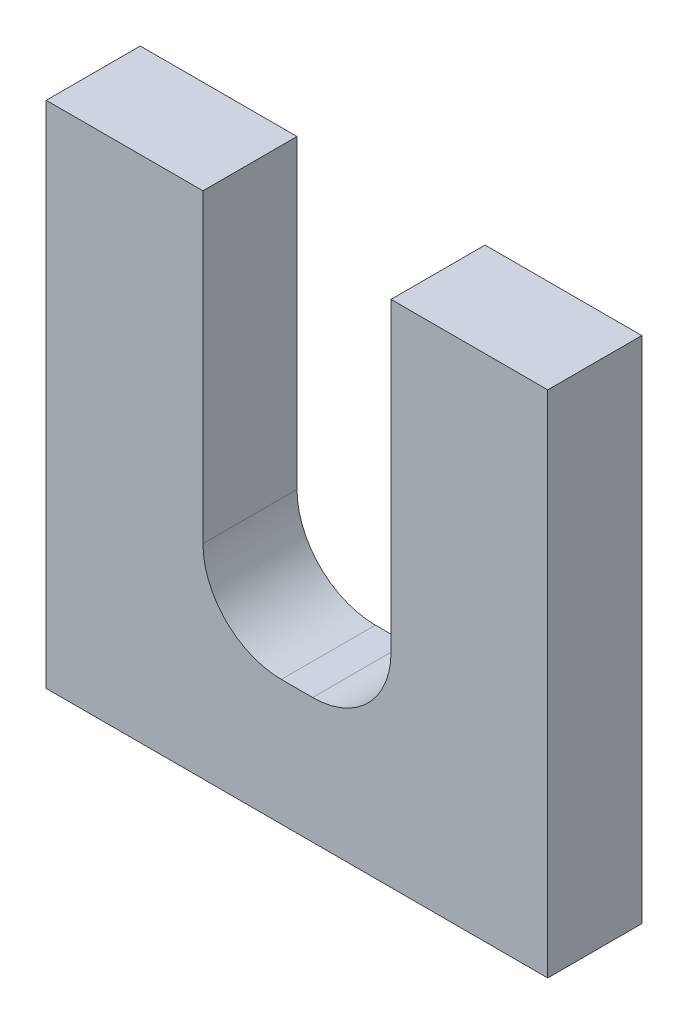
ISO-10303-21;
HEADER;
FILE_DESCRIPTION(('STEP AP214'),'2;1');
FILE_NAME('part.step','',(''),(''),'','','');
FILE_SCHEMA(('AUTOMOTIVE_DESIGN { 1 0 10303 214 1 1 1 1 }'));
ENDSEC;
DATA;
#1=APPLICATION_CONTEXT('core data for automotive mechanical design processes');
#2=APPLICATION_PROTOCOL_DEFINITION('international standard','automotive_design',2000,#1);
#3=PRODUCT_CONTEXT('',#1,'mechanical');
#4=PRODUCT('Part','Part','',(#3));
#5=PRODUCT_RELATED_PRODUCT_CATEGORY('part','',(#4));
#6=PRODUCT_DEFINITION_FORMATION('','',#4);
#7=PRODUCT_DEFINITION_CONTEXT('part definition',#1,'design');
#8=PRODUCT_DEFINITION('design','',#6,#7);
#9=PRODUCT_DEFINITION_SHAPE('','',#8);
#10=(LENGTH_UNIT() NAMED_UNIT(*) SI_UNIT(.MILLI.,.METRE.));
#11=(NAMED_UNIT(*) PLANE_ANGLE_UNIT() SI_UNIT($,.RADIAN.));
#12=(NAMED_UNIT(*) SI_UNIT($,.STERADIAN.) SOLID_ANGLE_UNIT());
#13=UNCERTAINTY_MEASURE_WITH_UNIT(LENGTH_MEASURE(1.E-05),#10,'distance_accuracy_value','');
#14=(GEOMETRIC_REPRESENTATION_CONTEXT(3) GLOBAL_UNCERTAINTY_ASSIGNED_CONTEXT((#13)) GLOBAL_UNIT_ASSIGNED_CONTEXT((#10,
#11,#12)) REPRESENTATION_CONTEXT('',''));
#15=CARTESIAN_POINT('',(0.,0.,0.));
#16=DIRECTION('',(0.,0.,1.));
#17=DIRECTION('',(1.,0.,0.));
#18=AXIS2_PLACEMENT_3D('',#15,#16,#17);
#19=CARTESIAN_POINT('',(-3.,8.12499999999999,1.5));
#20=DIRECTION('',(0.,-1.,0.));
#21=DIRECTION('',(1.,0.,0.));
#22=AXIS2_PLACEMENT_3D('',#19,#20,#21);
#23=PLANE('',#22);
#24=DIRECTION('',(-1.,0.,0.));
#25=VECTOR('',#24,1.);
#26=CARTESIAN_POINT('',(-3.,8.12499999999999,-1.5));
#27=LINE('',#26,#25);
#28=CARTESIAN_POINT('',(-3.,8.12499999999999,-1.5));
#29=VERTEX_POINT('',#28);
#30=CARTESIAN_POINT('',(-8.,8.12499999999999,-1.5));
#31=VERTEX_POINT('',#30);
#32=EDGE_CURVE('E145',#29,#31,#27,.T.);
#33=ORIENTED_EDGE('',*,*,#32,.T.);
#34=DIRECTION('',(0.,0.,-1.));
#35=VECTOR('',#34,1.);
#36=CARTESIAN_POINT('',(-8.,8.12499999999999,1.5));
#37=LINE('',#36,#35);
#38=CARTESIAN_POINT('',(-8.,8.12499999999999,1.5));
#39=VERTEX_POINT('',#38);
#40=EDGE_CURVE('E11',#39,#31,#37,.T.);
#41=ORIENTED_EDGE('',*,*,#40,.F.);
#42=DIRECTION('',(-1.,0.,0.));
#43=VECTOR('',#42,1.);
#44=CARTESIAN_POINT('',(-3.,8.12499999999999,1.5));
#45=LINE('',#44,#43);
#46=CARTESIAN_POINT('',(-3.,8.12499999999999,1.5));
#47=VERTEX_POINT('',#46);
#48=EDGE_CURVE('E163',#47,#39,#45,.T.);
#49=ORIENTED_EDGE('',*,*,#48,.F.);
#50=DIRECTION('',(0.,0.,-1.));
#51=VECTOR('',#50,1.);
#52=CARTESIAN_POINT('',(-3.,8.12499999999999,1.5));
#53=LINE('',#52,#51);
#54=EDGE_CURVE('E141',#47,#29,#53,.T.);
#55=ORIENTED_EDGE('',*,*,#54,.T.);
#56=EDGE_LOOP('',(#33,#41,#49,#55));
#57=FACE_BOUND('',#56,.T.);
#58=ADVANCED_FACE('F37',(#57),#23,.F.);
#59=CARTESIAN_POINT('',(-8.,-8.125,1.5));
#60=DIRECTION('',(1.,0.,0.));
#61=DIRECTION('',(0.,0.,-1.));
#62=AXIS2_PLACEMENT_3D('',#59,#60,#61);
#63=PLANE('',#62);
#64=DIRECTION('',(0.,-1.,0.));
#65=VECTOR('',#64,1.);
#66=CARTESIAN_POINT('',(-8.,-8.125,-1.5));
#67=LINE('',#66,#65);
#68=CARTESIAN_POINT('',(-8.,-8.125,-1.5));
#69=VERTEX_POINT('',#68);
#70=EDGE_CURVE('E148',#31,#69,#67,.T.);
#71=ORIENTED_EDGE('',*,*,#70,.T.);
#72=DIRECTION('',(0.,0.,-1.));
#73=VECTOR('',#72,1.);
#74=CARTESIAN_POINT('',(-8.,-8.125,1.5));
#75=LINE('',#74,#73);
#76=CARTESIAN_POINT('',(-8.,-8.125,1.5));
#77=VERTEX_POINT('',#76);
#78=EDGE_CURVE('E45',#77,#69,#75,.T.);
#79=ORIENTED_EDGE('',*,*,#78,.F.);
#80=DIRECTION('',(0.,-1.,0.));
#81=VECTOR('',#80,1.);
#82=CARTESIAN_POINT('',(-8.,-8.125,1.5));
#83=LINE('',#82,#81);
#84=EDGE_CURVE('E102',#39,#77,#83,.T.);
#85=ORIENTED_EDGE('',*,*,#84,.F.);
#86=ORIENTED_EDGE('',*,*,#40,.T.);
#87=EDGE_LOOP('',(#71,#79,#85,#86));
#88=FACE_BOUND('',#87,.T.);
#89=ADVANCED_FACE('F212',(#88),#63,.F.);
#90=CARTESIAN_POINT('',(8.,-8.125,1.5));
#91=DIRECTION('',(0.,1.,0.));
#92=DIRECTION('',(0.,0.,1.));
#93=AXIS2_PLACEMENT_3D('',#90,#91,#92);
#94=PLANE('',#93);
#95=DIRECTION('',(1.,0.,0.));
#96=VECTOR('',#95,1.);
#97=CARTESIAN_POINT('',(8.,-8.125,-1.5));
#98=LINE('',#97,#96);
#99=CARTESIAN_POINT('',(8.,-8.125,-1.5));
#100=VERTEX_POINT('',#99);
#101=EDGE_CURVE('E150',#69,#100,#98,.T.);
#102=ORIENTED_EDGE('',*,*,#101,.T.);
#103=DIRECTION('',(0.,0.,-1.));
#104=VECTOR('',#103,1.);
#105=CARTESIAN_POINT('',(8.,-8.125,1.5));
#106=LINE('',#105,#104);
#107=CARTESIAN_POINT('',(8.,-8.125,1.5));
#108=VERTEX_POINT('',#107);
#109=EDGE_CURVE('E176',#108,#100,#106,.T.);
#110=ORIENTED_EDGE('',*,*,#109,.F.);
#111=DIRECTION('',(1.,0.,0.));
#112=VECTOR('',#111,1.);
#113=CARTESIAN_POINT('',(8.,-8.125,1.5));
#114=LINE('',#113,#112);
#115=EDGE_CURVE('E184',#77,#108,#114,.T.);
#116=ORIENTED_EDGE('',*,*,#115,.F.);
#117=ORIENTED_EDGE('',*,*,#78,.T.);
#118=EDGE_LOOP('',(#102,#110,#116,#117));
#119=FACE_BOUND('',#118,.T.);
#120=ADVANCED_FACE('F182',(#119),#94,.F.);
#121=CARTESIAN_POINT('',(8.,-8.125,1.5));
#122=DIRECTION('',(-1.,0.,0.));
#123=DIRECTION('',(0.,0.,1.));
#124=AXIS2_PLACEMENT_3D('',#121,#122,#123);
#125=PLANE('',#124);
#126=DIRECTION('',(0.,1.,0.));
#127=VECTOR('',#126,1.);
#128=CARTESIAN_POINT('',(8.,-8.125,-1.5));
#129=LINE('',#128,#127);
#130=CARTESIAN_POINT('',(8.,8.125,-1.5));
#131=VERTEX_POINT('',#130);
#132=EDGE_CURVE('E152',#100,#131,#129,.T.);
#133=ORIENTED_EDGE('',*,*,#132,.T.);
#134=DIRECTION('',(0.,0.,-1.));
#135=VECTOR('',#134,1.);
#136=CARTESIAN_POINT('',(8.,8.125,1.5));
#137=LINE('',#136,#135);
#138=CARTESIAN_POINT('',(8.,8.125,1.5));
#139=VERTEX_POINT('',#138);
#140=EDGE_CURVE('E173',#139,#131,#137,.T.);
#141=ORIENTED_EDGE('',*,*,#140,.F.);
#142=DIRECTION('',(0.,1.,0.));
#143=VECTOR('',#142,1.);
#144=CARTESIAN_POINT('',(8.,-8.125,1.5));
#145=LINE('',#144,#143);
#146=EDGE_CURVE('E202',#108,#139,#145,.T.);
#147=ORIENTED_EDGE('',*,*,#146,.F.);
#148=ORIENTED_EDGE('',*,*,#109,.T.);
#149=EDGE_LOOP('',(#133,#141,#147,#148));
#150=FACE_BOUND('',#149,.T.);
#151=ADVANCED_FACE('F193',(#150),#125,.F.);
#152=CARTESIAN_POINT('',(8.,8.125,1.5));
#153=DIRECTION('',(0.,-1.,0.));
#154=DIRECTION('',(0.,0.,-1.));
#155=AXIS2_PLACEMENT_3D('',#152,#153,#154);
#156=PLANE('',#155);
#157=DIRECTION('',(-1.,0.,0.));
#158=VECTOR('',#157,1.);
#159=CARTESIAN_POINT('',(8.,8.125,-1.5));
#160=LINE('',#159,#158);
#161=CARTESIAN_POINT('',(3.,8.125,-1.5));
#162=VERTEX_POINT('',#161);
#163=EDGE_CURVE('E154',#131,#162,#160,.T.);
#164=ORIENTED_EDGE('',*,*,#163,.T.);
#165=DIRECTION('',(0.,0.,-1.));
#166=VECTOR('',#165,1.);
#167=CARTESIAN_POINT('',(3.,8.125,1.5));
#168=LINE('',#167,#166);
#169=CARTESIAN_POINT('',(3.,8.125,1.5));
#170=VERTEX_POINT('',#169);
#171=EDGE_CURVE('E170',#170,#162,#168,.T.);
#172=ORIENTED_EDGE('',*,*,#171,.F.);
#173=DIRECTION('',(-1.,0.,0.));
#174=VECTOR('',#173,1.);
#175=CARTESIAN_POINT('',(8.,8.125,1.5));
#176=LINE('',#175,#174);
#177=EDGE_CURVE('E199',#139,#170,#176,.T.);
#178=ORIENTED_EDGE('',*,*,#177,.F.);
#179=ORIENTED_EDGE('',*,*,#140,.T.);
#180=EDGE_LOOP('',(#164,#172,#178,#179));
#181=FACE_BOUND('',#180,.T.);
#182=ADVANCED_FACE('F197',(#181),#156,.F.);
#183=CARTESIAN_POINT('',(3.,-1.62500000000001,1.5));
#184=DIRECTION('',(1.,0.,0.));
#185=DIRECTION('',(0.,1.,0.));
#186=AXIS2_PLACEMENT_3D('',#183,#184,#185);
#187=PLANE('',#186);
#188=DIRECTION('',(0.,-1.,0.));
#189=VECTOR('',#188,1.);
#190=CARTESIAN_POINT('',(3.,-1.62500000000001,-1.5));
#191=LINE('',#190,#189);
#192=CARTESIAN_POINT('',(3.,-1.62500000000001,-1.5));
#193=VERTEX_POINT('',#192);
#194=EDGE_CURVE('E156',#162,#193,#191,.T.);
#195=ORIENTED_EDGE('',*,*,#194,.T.);
#196=DIRECTION('',(0.,0.,-1.));
#197=VECTOR('',#196,1.);
#198=CARTESIAN_POINT('',(3.,-1.62500000000001,1.5));
#199=LINE('',#198,#197);
#200=CARTESIAN_POINT('',(3.,-1.62500000000001,1.5));
#201=VERTEX_POINT('',#200);
#202=EDGE_CURVE('E167',#201,#193,#199,.T.);
#203=ORIENTED_EDGE('',*,*,#202,.F.);
#204=DIRECTION('',(0.,-1.,0.));
#205=VECTOR('',#204,1.);
#206=CARTESIAN_POINT('',(3.,-1.62500000000001,1.5));
#207=LINE('',#206,#205);
#208=EDGE_CURVE('E201',#170,#201,#207,.T.);
#209=ORIENTED_EDGE('',*,*,#208,.F.);
#210=ORIENTED_EDGE('',*,*,#171,.T.);
#211=EDGE_LOOP('',(#195,#203,#209,#210));
#212=FACE_BOUND('',#211,.T.);
#213=ADVANCED_FACE('F224',(#212),#187,.F.);
#214=CARTESIAN_POINT('',(0.500000000000003,-1.62500000000001,1.5));
#215=DIRECTION('',(0.,0.,-1.));
#216=DIRECTION('',(-1.,0.,0.));
#217=AXIS2_PLACEMENT_3D('',#214,#215,#216);
#218=CYLINDRICAL_SURFACE('',#217,2.5);
#219=CARTESIAN_POINT('',(0.500000000000003,-1.62500000000001,-1.5));
#220=DIRECTION('',(0.,0.,-1.));
#221=DIRECTION('',(1.,0.,0.));
#222=AXIS2_PLACEMENT_3D('',#219,#220,#221);
#223=CIRCLE('',#222,2.5);
#224=CARTESIAN_POINT('',(0.500000000000003,-4.12500000000001,-1.5));
#225=VERTEX_POINT('',#224);
#226=EDGE_CURVE('E158',#193,#225,#223,.T.);
#227=ORIENTED_EDGE('',*,*,#226,.T.);
#228=DIRECTION('',(0.,0.,-1.));
#229=VECTOR('',#228,1.);
#230=CARTESIAN_POINT('',(0.500000000000003,-4.12500000000001,1.5));
#231=LINE('',#230,#229);
#232=CARTESIAN_POINT('',(0.500000000000003,-4.12500000000001,1.5));
#233=VERTEX_POINT('',#232);
#234=EDGE_CURVE('E136',#233,#225,#231,.T.);
#235=ORIENTED_EDGE('',*,*,#234,.F.);
#236=CARTESIAN_POINT('',(0.500000000000003,-1.62500000000001,1.5));
#237=DIRECTION('',(0.,0.,-1.));
#238=DIRECTION('',(1.,0.,0.));
#239=AXIS2_PLACEMENT_3D('',#236,#237,#238);
#240=CIRCLE('',#239,2.5);
#241=EDGE_CURVE('E127',#201,#233,#240,.T.);
#242=ORIENTED_EDGE('',*,*,#241,.F.);
#243=ORIENTED_EDGE('',*,*,#202,.T.);
#244=EDGE_LOOP('',(#227,#235,#242,#243));
#245=FACE_BOUND('',#244,.T.);
#246=ADVANCED_FACE('F227',(#245),#218,.F.);
#247=CARTESIAN_POINT('',(-0.499999999999999,-4.12500000000001,1.5));
#248=DIRECTION('',(0.,-1.,0.));
#249=DIRECTION('',(0.,0.,-1.));
#250=AXIS2_PLACEMENT_3D('',#247,#248,#249);
#251=PLANE('',#250);
#252=DIRECTION('',(-1.,0.,0.));
#253=VECTOR('',#252,1.);
#254=CARTESIAN_POINT('',(-0.499999999999999,-4.12500000000001,-1.5));
#255=LINE('',#254,#253);
#256=CARTESIAN_POINT('',(-0.499999999999999,-4.12500000000001,-1.5));
#257=VERTEX_POINT('',#256);
#258=EDGE_CURVE('E135',#225,#257,#255,.T.);
#259=ORIENTED_EDGE('',*,*,#258,.T.);
#260=DIRECTION('',(0.,0.,-1.));
#261=VECTOR('',#260,1.);
#262=CARTESIAN_POINT('',(-0.499999999999999,-4.12500000000001,1.5));
#263=LINE('',#262,#261);
#264=CARTESIAN_POINT('',(-0.499999999999999,-4.12500000000001,1.5));
#265=VERTEX_POINT('',#264);
#266=EDGE_CURVE('E132',#265,#257,#263,.T.);
#267=ORIENTED_EDGE('',*,*,#266,.F.);
#268=DIRECTION('',(-1.,0.,0.));
#269=VECTOR('',#268,1.);
#270=CARTESIAN_POINT('',(-0.499999999999999,-4.12500000000001,1.5));
#271=LINE('',#270,#269);
#272=EDGE_CURVE('E121',#233,#265,#271,.T.);
#273=ORIENTED_EDGE('',*,*,#272,.F.);
#274=ORIENTED_EDGE('',*,*,#234,.T.);
#275=EDGE_LOOP('',(#259,#267,#273,#274));
#276=FACE_BOUND('',#275,.T.);
#277=ADVANCED_FACE('F133',(#276),#251,.F.);
#278=CARTESIAN_POINT('',(-0.499999999999999,-1.62500000000001,1.5));
#279=DIRECTION('',(0.,0.,-1.));
#280=DIRECTION('',(-1.,0.,0.));
#281=AXIS2_PLACEMENT_3D('',#278,#279,#280);
#282=CYLINDRICAL_SURFACE('',#281,2.5);
#283=CARTESIAN_POINT('',(-0.499999999999999,-1.62500000000001,-1.5));
#284=DIRECTION('',(0.,0.,-1.));
#285=DIRECTION('',(1.,0.,0.));
#286=AXIS2_PLACEMENT_3D('',#283,#284,#285);
#287=CIRCLE('',#286,2.5);
#288=CARTESIAN_POINT('',(-3.,-1.62500000000001,-1.5));
#289=VERTEX_POINT('',#288);
#290=EDGE_CURVE('E88',#257,#289,#287,.T.);
#291=ORIENTED_EDGE('',*,*,#290,.T.);
#292=DIRECTION('',(0.,0.,-1.));
#293=VECTOR('',#292,1.);
#294=CARTESIAN_POINT('',(-3.,-1.62500000000001,1.5));
#295=LINE('',#294,#293);
#296=CARTESIAN_POINT('',(-3.,-1.62500000000001,1.5));
#297=VERTEX_POINT('',#296);
#298=EDGE_CURVE('E137',#297,#289,#295,.T.);
#299=ORIENTED_EDGE('',*,*,#298,.F.);
#300=CARTESIAN_POINT('',(-0.499999999999999,-1.62500000000001,1.5));
#301=DIRECTION('',(0.,0.,-1.));
#302=DIRECTION('',(1.,0.,0.));
#303=AXIS2_PLACEMENT_3D('',#300,#301,#302);
#304=CIRCLE('',#303,2.5);
#305=EDGE_CURVE('E125',#265,#297,#304,.T.);
#306=ORIENTED_EDGE('',*,*,#305,.F.);
#307=ORIENTED_EDGE('',*,*,#266,.T.);
#308=EDGE_LOOP('',(#291,#299,#306,#307));
#309=FACE_BOUND('',#308,.T.);
#310=ADVANCED_FACE('F139',(#309),#282,.F.);
#311=CARTESIAN_POINT('',(-3.,8.12499999999999,1.5));
#312=DIRECTION('',(-1.,0.,0.));
#313=DIRECTION('',(0.,-1.,0.));
#314=AXIS2_PLACEMENT_3D('',#311,#312,#313);
#315=PLANE('',#314);
#316=DIRECTION('',(0.,1.,0.));
#317=VECTOR('',#316,1.);
#318=CARTESIAN_POINT('',(-3.,8.12499999999999,-1.5));
#319=LINE('',#318,#317);
#320=EDGE_CURVE('E94',#289,#29,#319,.T.);
#321=ORIENTED_EDGE('',*,*,#320,.T.);
#322=ORIENTED_EDGE('',*,*,#54,.F.);
#323=DIRECTION('',(0.,1.,0.));
#324=VECTOR('',#323,1.);
#325=CARTESIAN_POINT('',(-3.,8.12499999999999,1.5));
#326=LINE('',#325,#324);
#327=EDGE_CURVE('E53',#297,#47,#326,.T.);
#328=ORIENTED_EDGE('',*,*,#327,.F.);
#329=ORIENTED_EDGE('',*,*,#298,.T.);
#330=EDGE_LOOP('',(#321,#322,#328,#329));
#331=FACE_BOUND('',#330,.T.);
#332=ADVANCED_FACE('F236',(#331),#315,.F.);
#333=CARTESIAN_POINT('',(0.500000000000003,-1.62500000000001,1.5));
#334=DIRECTION('',(0.,0.,1.));
#335=DIRECTION('',(1.,0.,0.));
#336=AXIS2_PLACEMENT_3D('',#333,#334,#335);
#337=PLANE('',#336);
#338=ORIENTED_EDGE('',*,*,#48,.T.);
#339=ORIENTED_EDGE('',*,*,#84,.T.);
#340=ORIENTED_EDGE('',*,*,#115,.T.);
#341=ORIENTED_EDGE('',*,*,#146,.T.);
#342=ORIENTED_EDGE('',*,*,#177,.T.);
#343=ORIENTED_EDGE('',*,*,#208,.T.);
#344=ORIENTED_EDGE('',*,*,#241,.T.);
#345=ORIENTED_EDGE('',*,*,#272,.T.);
#346=ORIENTED_EDGE('',*,*,#305,.T.);
#347=ORIENTED_EDGE('',*,*,#327,.T.);
#348=EDGE_LOOP('',(#338,#339,#340,#341,#342,#343,#344,#345,#346,#347));
#349=FACE_BOUND('',#348,.T.);
#350=ADVANCED_FACE('F123',(#349),#337,.T.);
#351=CARTESIAN_POINT('',(0.500000000000003,-1.62500000000001,-1.5));
#352=DIRECTION('',(0.,0.,1.));
#353=DIRECTION('',(1.,0.,0.));
#354=AXIS2_PLACEMENT_3D('',#351,#352,#353);
#355=PLANE('',#354);
#356=ORIENTED_EDGE('',*,*,#32,.F.);
#357=ORIENTED_EDGE('',*,*,#320,.F.);
#358=ORIENTED_EDGE('',*,*,#290,.F.);
#359=ORIENTED_EDGE('',*,*,#258,.F.);
#360=ORIENTED_EDGE('',*,*,#226,.F.);
#361=ORIENTED_EDGE('',*,*,#194,.F.);
#362=ORIENTED_EDGE('',*,*,#163,.F.);
#363=ORIENTED_EDGE('',*,*,#132,.F.);
#364=ORIENTED_EDGE('',*,*,#101,.F.);
#365=ORIENTED_EDGE('',*,*,#70,.F.);
#366=EDGE_LOOP('',(#356,#357,#358,#359,#360,#361,#362,#363,#364,#365));
#367=FACE_BOUND('',#366,.T.);
#368=ADVANCED_FACE('F188',(#367),#355,.F.);
#369=CLOSED_SHELL('',(#58,#89,#120,#151,#182,#213,#246,#277,#310,#332,#350,#368));
#370=MANIFOLD_SOLID_BREP('B2',#369);
#371=ADVANCED_BREP_SHAPE_REPRESENTATION('',(#18,#370),#14);
#372=SHAPE_DEFINITION_REPRESENTATION(#9,#371);
ENDSEC;
END-ISO-10303-21;
